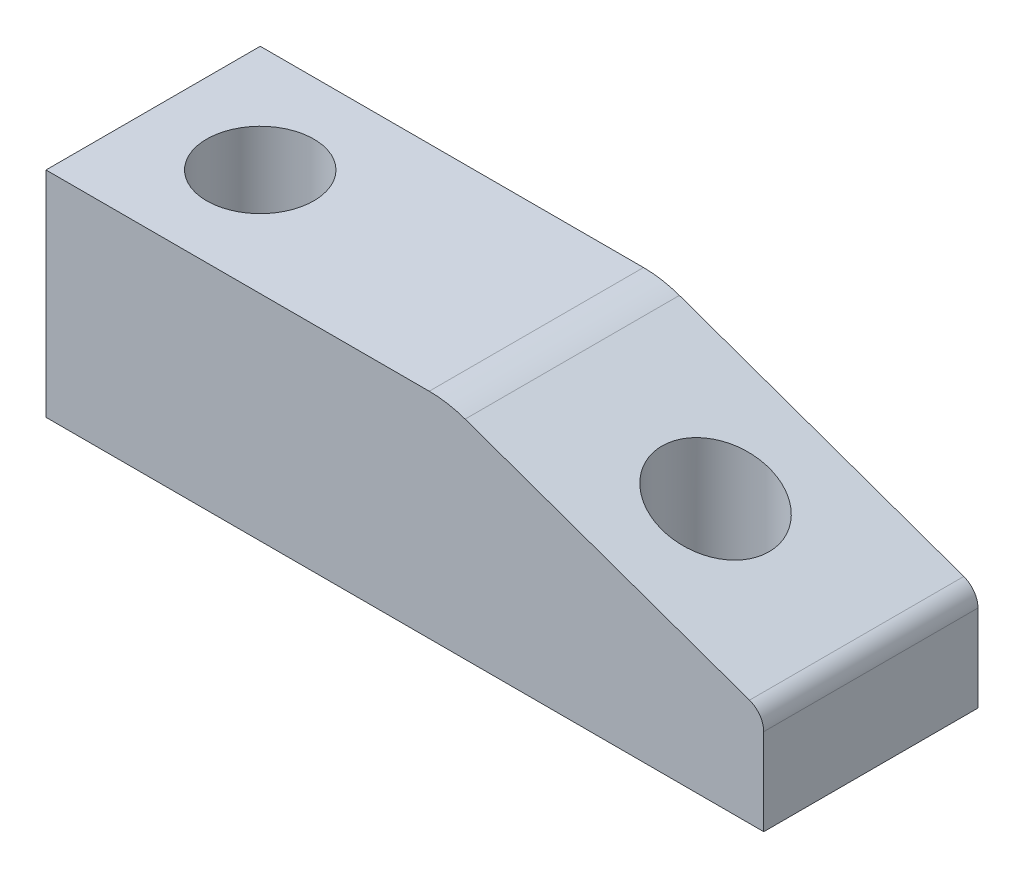
ISO-10303-21;
HEADER;
FILE_DESCRIPTION(('STEP AP214'),'2;1');
FILE_NAME('part.step','',(''),(''),'','','');
FILE_SCHEMA(('AUTOMOTIVE_DESIGN { 1 0 10303 214 1 1 1 1 }'));
ENDSEC;
DATA;
#1=APPLICATION_CONTEXT('core data for automotive mechanical design processes');
#2=APPLICATION_PROTOCOL_DEFINITION('international standard','automotive_design',2000,#1);
#3=PRODUCT_CONTEXT('',#1,'mechanical');
#4=PRODUCT('Part','Part','',(#3));
#5=PRODUCT_RELATED_PRODUCT_CATEGORY('part','',(#4));
#6=PRODUCT_DEFINITION_FORMATION('','',#4);
#7=PRODUCT_DEFINITION_CONTEXT('part definition',#1,'design');
#8=PRODUCT_DEFINITION('design','',#6,#7);
#9=PRODUCT_DEFINITION_SHAPE('','',#8);
#10=(LENGTH_UNIT() NAMED_UNIT(*) SI_UNIT(.MILLI.,.METRE.));
#11=(NAMED_UNIT(*) PLANE_ANGLE_UNIT() SI_UNIT($,.RADIAN.));
#12=(NAMED_UNIT(*) SI_UNIT($,.STERADIAN.) SOLID_ANGLE_UNIT());
#13=UNCERTAINTY_MEASURE_WITH_UNIT(LENGTH_MEASURE(1.E-05),#10,'distance_accuracy_value','');
#14=(GEOMETRIC_REPRESENTATION_CONTEXT(3) GLOBAL_UNCERTAINTY_ASSIGNED_CONTEXT((#13)) GLOBAL_UNIT_ASSIGNED_CONTEXT((#10,
#11,#12)) REPRESENTATION_CONTEXT('',''));
#15=CARTESIAN_POINT('',(0.,0.,0.));
#16=DIRECTION('',(0.,0.,1.));
#17=DIRECTION('',(1.,0.,0.));
#18=AXIS2_PLACEMENT_3D('',#15,#16,#17);
#19=CARTESIAN_POINT('',(67.,20.,-20.));
#20=DIRECTION('',(1.,0.,0.));
#21=DIRECTION('',(0.,0.,-1.));
#22=AXIS2_PLACEMENT_3D('',#19,#20,#21);
#23=PLANE('',#22);
#24=DIRECTION('',(0.,1.,0.));
#25=VECTOR('',#24,1.);
#26=CARTESIAN_POINT('',(67.,20.,-20.));
#27=LINE('',#26,#25);
#28=CARTESIAN_POINT('',(67.,-20.,-20.));
#29=VERTEX_POINT('',#28);
#30=CARTESIAN_POINT('',(67.,-3.82209310151896,-20.));
#31=VERTEX_POINT('',#30);
#32=EDGE_CURVE('E128',#29,#31,#27,.T.);
#33=ORIENTED_EDGE('',*,*,#32,.T.);
#34=DIRECTION('',(0.,0.,1.));
#35=VECTOR('',#34,1.);
#36=CARTESIAN_POINT('',(67.,-3.82209310151896,20.));
#37=LINE('',#36,#35);
#38=CARTESIAN_POINT('',(67.,-3.82209310151896,20.));
#39=VERTEX_POINT('',#38);
#40=EDGE_CURVE('E161',#31,#39,#37,.T.);
#41=ORIENTED_EDGE('',*,*,#40,.T.);
#42=DIRECTION('',(0.,1.,0.));
#43=VECTOR('',#42,1.);
#44=CARTESIAN_POINT('',(67.,20.,20.));
#45=LINE('',#44,#43);
#46=CARTESIAN_POINT('',(67.,-20.,20.));
#47=VERTEX_POINT('',#46);
#48=EDGE_CURVE('E109',#47,#39,#45,.T.);
#49=ORIENTED_EDGE('',*,*,#48,.F.);
#50=DIRECTION('',(0.,0.,1.));
#51=VECTOR('',#50,1.);
#52=CARTESIAN_POINT('',(67.,-20.,-20.));
#53=LINE('',#52,#51);
#54=EDGE_CURVE('E143',#29,#47,#53,.T.);
#55=ORIENTED_EDGE('',*,*,#54,.F.);
#56=EDGE_LOOP('',(#33,#41,#49,#55));
#57=FACE_BOUND('',#56,.T.);
#58=ADVANCED_FACE('F39',(#57),#23,.T.);
#59=CARTESIAN_POINT('',(-67.,-20.,-20.));
#60=DIRECTION('',(0.,-1.,0.));
#61=DIRECTION('',(0.,0.,-1.));
#62=AXIS2_PLACEMENT_3D('',#59,#60,#61);
#63=PLANE('',#62);
#64=CARTESIAN_POINT('',(-47.,-20.,0.));
#65=DIRECTION('',(0.,-1.,0.));
#66=DIRECTION('',(0.,0.,-1.));
#67=AXIS2_PLACEMENT_3D('',#64,#65,#66);
#68=CIRCLE('',#67,6.);
#69=CARTESIAN_POINT('',(-47.,-20.,-6.));
#70=VERTEX_POINT('',#69);
#71=EDGE_CURVE('E187',#70,#70,#68,.F.);
#72=ORIENTED_EDGE('',*,*,#71,.T.);
#73=EDGE_LOOP('',(#72));
#74=FACE_BOUND('',#73,.T.);
#75=CARTESIAN_POINT('',(38.,-20.,0.));
#76=DIRECTION('',(0.,-1.,0.));
#77=DIRECTION('',(0.,0.,-1.));
#78=AXIS2_PLACEMENT_3D('',#75,#76,#77);
#79=CIRCLE('',#78,6.);
#80=CARTESIAN_POINT('',(38.,-20.,-6.));
#81=VERTEX_POINT('',#80);
#82=EDGE_CURVE('E195',#81,#81,#79,.F.);
#83=ORIENTED_EDGE('',*,*,#82,.T.);
#84=EDGE_LOOP('',(#83));
#85=FACE_BOUND('',#84,.T.);
#86=ORIENTED_EDGE('',*,*,#54,.T.);
#87=DIRECTION('',(1.,0.,0.));
#88=VECTOR('',#87,1.);
#89=CARTESIAN_POINT('',(-67.,-20.,20.));
#90=LINE('',#89,#88);
#91=CARTESIAN_POINT('',(-67.,-20.,20.));
#92=VERTEX_POINT('',#91);
#93=EDGE_CURVE('E125',#92,#47,#90,.T.);
#94=ORIENTED_EDGE('',*,*,#93,.F.);
#95=DIRECTION('',(0.,0.,1.));
#96=VECTOR('',#95,1.);
#97=CARTESIAN_POINT('',(-67.,-20.,-20.));
#98=LINE('',#97,#96);
#99=CARTESIAN_POINT('',(-67.,-20.,-20.));
#100=VERTEX_POINT('',#99);
#101=EDGE_CURVE('E120',#100,#92,#98,.T.);
#102=ORIENTED_EDGE('',*,*,#101,.F.);
#103=DIRECTION('',(1.,0.,0.));
#104=VECTOR('',#103,1.);
#105=CARTESIAN_POINT('',(-67.,-20.,-20.));
#106=LINE('',#105,#104);
#107=EDGE_CURVE('E121',#100,#29,#106,.T.);
#108=ORIENTED_EDGE('',*,*,#107,.T.);
#109=EDGE_LOOP('',(#86,#94,#102,#108));
#110=FACE_BOUND('',#109,.T.);
#111=ADVANCED_FACE('F237',(#74,#85,#110),#63,.T.);
#112=CARTESIAN_POINT('',(-67.,20.,-20.));
#113=DIRECTION('',(-1.,0.,0.));
#114=DIRECTION('',(0.,0.,1.));
#115=AXIS2_PLACEMENT_3D('',#112,#113,#114);
#116=PLANE('',#115);
#117=ORIENTED_EDGE('',*,*,#101,.T.);
#118=DIRECTION('',(0.,-1.,0.));
#119=VECTOR('',#118,1.);
#120=CARTESIAN_POINT('',(-67.,20.,20.));
#121=LINE('',#120,#119);
#122=CARTESIAN_POINT('',(-67.,20.,20.));
#123=VERTEX_POINT('',#122);
#124=EDGE_CURVE('E103',#123,#92,#121,.T.);
#125=ORIENTED_EDGE('',*,*,#124,.F.);
#126=DIRECTION('',(0.,0.,1.));
#127=VECTOR('',#126,1.);
#128=CARTESIAN_POINT('',(-67.,20.,-20.));
#129=LINE('',#128,#127);
#130=CARTESIAN_POINT('',(-67.,20.,-20.));
#131=VERTEX_POINT('',#130);
#132=EDGE_CURVE('E112',#131,#123,#129,.T.);
#133=ORIENTED_EDGE('',*,*,#132,.F.);
#134=DIRECTION('',(0.,-1.,0.));
#135=VECTOR('',#134,1.);
#136=CARTESIAN_POINT('',(-67.,20.,-20.));
#137=LINE('',#136,#135);
#138=EDGE_CURVE('E137',#131,#100,#137,.T.);
#139=ORIENTED_EDGE('',*,*,#138,.T.);
#140=EDGE_LOOP('',(#117,#125,#133,#139));
#141=FACE_BOUND('',#140,.T.);
#142=ADVANCED_FACE('F123',(#141),#116,.T.);
#143=CARTESIAN_POINT('',(-67.,20.,-20.));
#144=DIRECTION('',(0.,1.,0.));
#145=DIRECTION('',(0.,0.,1.));
#146=AXIS2_PLACEMENT_3D('',#143,#144,#145);
#147=PLANE('',#146);
#148=CARTESIAN_POINT('',(-47.,20.,0.));
#149=DIRECTION('',(0.,1.,0.));
#150=DIRECTION('',(0.,0.,1.));
#151=AXIS2_PLACEMENT_3D('',#148,#149,#150);
#152=CIRCLE('',#151,10.);
#153=CARTESIAN_POINT('',(-47.,20.,10.));
#154=VERTEX_POINT('',#153);
#155=EDGE_CURVE('E186',#154,#154,#152,.T.);
#156=ORIENTED_EDGE('',*,*,#155,.F.);
#157=EDGE_LOOP('',(#156));
#158=FACE_BOUND('',#157,.T.);
#159=DIRECTION('',(-1.,0.,0.));
#160=VECTOR('',#159,1.);
#161=CARTESIAN_POINT('',(-67.,20.,20.));
#162=LINE('',#161,#160);
#163=CARTESIAN_POINT('',(4.54678738342408,20.,20.));
#164=VERTEX_POINT('',#163);
#165=EDGE_CURVE('E98',#164,#123,#162,.T.);
#166=ORIENTED_EDGE('',*,*,#165,.F.);
#167=DIRECTION('',(0.,0.,1.));
#168=VECTOR('',#167,1.);
#169=CARTESIAN_POINT('',(4.54678738342408,20.,-20.));
#170=LINE('',#169,#168);
#171=CARTESIAN_POINT('',(4.54678738342408,20.,-20.));
#172=VERTEX_POINT('',#171);
#173=EDGE_CURVE('E154',#164,#172,#170,.F.);
#174=ORIENTED_EDGE('',*,*,#173,.T.);
#175=DIRECTION('',(-1.,0.,0.));
#176=VECTOR('',#175,1.);
#177=CARTESIAN_POINT('',(-67.,20.,-20.));
#178=LINE('',#177,#176);
#179=EDGE_CURVE('E115',#172,#131,#178,.T.);
#180=ORIENTED_EDGE('',*,*,#179,.T.);
#181=ORIENTED_EDGE('',*,*,#132,.T.);
#182=EDGE_LOOP('',(#166,#174,#180,#181));
#183=FACE_BOUND('',#182,.T.);
#184=ADVANCED_FACE('F113',(#158,#183),#147,.T.);
#185=CARTESIAN_POINT('',(0.,0.,-20.));
#186=DIRECTION('',(0.,0.,1.));
#187=DIRECTION('',(1.,0.,0.));
#188=AXIS2_PLACEMENT_3D('',#185,#186,#187);
#189=PLANE('',#188);
#190=DIRECTION('',(-0.942102631717715,0.335324665526644,0.));
#191=VECTOR('',#190,1.);
#192=CARTESIAN_POINT('',(7.99999999999999,20.,-20.));
#193=LINE('',#192,#191);
#194=CARTESIAN_POINT('',(64.3412986621066,-0.0536825746481027,-20.));
#195=VERTEX_POINT('',#194);
#196=CARTESIAN_POINT('',(11.253280693957,18.8420526343543,-20.));
#197=VERTEX_POINT('',#196);
#198=EDGE_CURVE('E175',#195,#197,#193,.T.);
#199=ORIENTED_EDGE('',*,*,#198,.F.);
#200=CARTESIAN_POINT('',(63.,-3.82209310151896,-20.));
#201=DIRECTION('',(0.,0.,1.));
#202=DIRECTION('',(1.,0.,0.));
#203=AXIS2_PLACEMENT_3D('',#200,#201,#202);
#204=CIRCLE('',#203,4.);
#205=EDGE_CURVE('E11',#195,#31,#204,.F.);
#206=ORIENTED_EDGE('',*,*,#205,.T.);
#207=ORIENTED_EDGE('',*,*,#32,.F.);
#208=ORIENTED_EDGE('',*,*,#107,.F.);
#209=ORIENTED_EDGE('',*,*,#138,.F.);
#210=ORIENTED_EDGE('',*,*,#179,.F.);
#211=CARTESIAN_POINT('',(4.54678738342408,0.,-20.));
#212=DIRECTION('',(0.,0.,1.));
#213=DIRECTION('',(1.,0.,0.));
#214=AXIS2_PLACEMENT_3D('',#211,#212,#213);
#215=CIRCLE('',#214,20.);
#216=EDGE_CURVE('E157',#172,#197,#215,.F.);
#217=ORIENTED_EDGE('',*,*,#216,.T.);
#218=EDGE_LOOP('',(#199,#206,#207,#208,#209,#210,#217));
#219=FACE_BOUND('',#218,.T.);
#220=ADVANCED_FACE('F229',(#219),#189,.F.);
#221=CARTESIAN_POINT('',(0.,0.,20.));
#222=DIRECTION('',(0.,0.,1.));
#223=DIRECTION('',(1.,0.,0.));
#224=AXIS2_PLACEMENT_3D('',#221,#222,#223);
#225=PLANE('',#224);
#226=ORIENTED_EDGE('',*,*,#48,.T.);
#227=CARTESIAN_POINT('',(63.,-3.82209310151896,20.));
#228=DIRECTION('',(0.,0.,1.));
#229=DIRECTION('',(1.,0.,0.));
#230=AXIS2_PLACEMENT_3D('',#227,#228,#229);
#231=CIRCLE('',#230,4.);
#232=CARTESIAN_POINT('',(64.3412986621066,-0.0536825746480923,20.));
#233=VERTEX_POINT('',#232);
#234=EDGE_CURVE('E63',#39,#233,#231,.T.);
#235=ORIENTED_EDGE('',*,*,#234,.T.);
#236=DIRECTION('',(0.942102631717715,-0.335324665526644,0.));
#237=VECTOR('',#236,1.);
#238=CARTESIAN_POINT('',(7.99999999999999,20.,20.));
#239=LINE('',#238,#237);
#240=CARTESIAN_POINT('',(11.253280693957,18.8420526343543,20.));
#241=VERTEX_POINT('',#240);
#242=EDGE_CURVE('E177',#241,#233,#239,.T.);
#243=ORIENTED_EDGE('',*,*,#242,.F.);
#244=CARTESIAN_POINT('',(4.54678738342408,0.,20.));
#245=DIRECTION('',(0.,0.,1.));
#246=DIRECTION('',(1.,0.,0.));
#247=AXIS2_PLACEMENT_3D('',#244,#245,#246);
#248=CIRCLE('',#247,20.);
#249=EDGE_CURVE('E105',#241,#164,#248,.T.);
#250=ORIENTED_EDGE('',*,*,#249,.T.);
#251=ORIENTED_EDGE('',*,*,#165,.T.);
#252=ORIENTED_EDGE('',*,*,#124,.T.);
#253=ORIENTED_EDGE('',*,*,#93,.T.);
#254=EDGE_LOOP('',(#226,#235,#243,#250,#251,#252,#253));
#255=FACE_BOUND('',#254,.T.);
#256=ADVANCED_FACE('F100',(#255),#225,.T.);
#257=CARTESIAN_POINT('',(7.99999999999999,20.,-82.6258732474047));
#258=DIRECTION('',(-0.335324665526644,-0.942102631717715,0.));
#259=DIRECTION('',(0.942102631717715,-0.335324665526644,0.));
#260=AXIS2_PLACEMENT_3D('',#257,#258,#259);
#261=PLANE('',#260);
#262=CARTESIAN_POINT('',(38.,9.32203389830509,0.));
#263=DIRECTION('',(-0.335324665526644,-0.942102631717715,0.));
#264=DIRECTION('',(-0.942102631717715,0.335324665526644,0.));
#265=AXIS2_PLACEMENT_3D('',#262,#263,#264);
#266=ELLIPSE('',#265,10.6145547876957,10.);
#267=CARTESIAN_POINT('',(28.,12.8813559322034,0.));
#268=VERTEX_POINT('',#267);
#269=EDGE_CURVE('E43',#268,#268,#266,.T.);
#270=ORIENTED_EDGE('',*,*,#269,.T.);
#271=EDGE_LOOP('',(#270));
#272=FACE_BOUND('',#271,.T.);
#273=ORIENTED_EDGE('',*,*,#242,.T.);
#274=DIRECTION('',(0.,0.,1.));
#275=VECTOR('',#274,1.);
#276=CARTESIAN_POINT('',(64.3412986621066,-0.0536825746480954,-20.));
#277=LINE('',#276,#275);
#278=EDGE_CURVE('E49',#233,#195,#277,.F.);
#279=ORIENTED_EDGE('',*,*,#278,.T.);
#280=ORIENTED_EDGE('',*,*,#198,.T.);
#281=DIRECTION('',(0.,0.,1.));
#282=VECTOR('',#281,1.);
#283=CARTESIAN_POINT('',(11.253280693957,18.8420526343543,20.));
#284=LINE('',#283,#282);
#285=EDGE_CURVE('E146',#197,#241,#284,.T.);
#286=ORIENTED_EDGE('',*,*,#285,.T.);
#287=EDGE_LOOP('',(#273,#279,#280,#286));
#288=FACE_BOUND('',#287,.T.);
#289=ADVANCED_FACE('F248',(#272,#288),#261,.F.);
#290=CARTESIAN_POINT('',(4.54678738342408,0.,-82.6258732474047));
#291=DIRECTION('',(0.,0.,-1.));
#292=DIRECTION('',(-1.,0.,0.));
#293=AXIS2_PLACEMENT_3D('',#290,#291,#292);
#294=CYLINDRICAL_SURFACE('',#293,20.);
#295=ORIENTED_EDGE('',*,*,#216,.F.);
#296=ORIENTED_EDGE('',*,*,#173,.F.);
#297=ORIENTED_EDGE('',*,*,#249,.F.);
#298=ORIENTED_EDGE('',*,*,#285,.F.);
#299=EDGE_LOOP('',(#295,#296,#297,#298));
#300=FACE_BOUND('',#299,.T.);
#301=ADVANCED_FACE('F246',(#300),#294,.T.);
#302=CARTESIAN_POINT('',(63.,-3.82209310151896,-20.));
#303=DIRECTION('',(0.,0.,-1.));
#304=DIRECTION('',(-1.,0.,0.));
#305=AXIS2_PLACEMENT_3D('',#302,#303,#304);
#306=CYLINDRICAL_SURFACE('',#305,4.);
#307=ORIENTED_EDGE('',*,*,#205,.F.);
#308=ORIENTED_EDGE('',*,*,#278,.F.);
#309=ORIENTED_EDGE('',*,*,#234,.F.);
#310=ORIENTED_EDGE('',*,*,#40,.F.);
#311=EDGE_LOOP('',(#307,#308,#309,#310));
#312=FACE_BOUND('',#311,.T.);
#313=ADVANCED_FACE('F41',(#312),#306,.T.);
#314=CARTESIAN_POINT('',(38.,-9.,0.));
#315=DIRECTION('',(0.,1.,0.));
#316=DIRECTION('',(0.,0.,1.));
#317=AXIS2_PLACEMENT_3D('',#314,#315,#316);
#318=CYLINDRICAL_SURFACE('',#317,10.);
#319=CARTESIAN_POINT('',(38.,-9.,0.));
#320=DIRECTION('',(0.,1.,0.));
#321=DIRECTION('',(0.,0.,1.));
#322=AXIS2_PLACEMENT_3D('',#319,#320,#321);
#323=CIRCLE('',#322,10.);
#324=CARTESIAN_POINT('',(38.,-9.,10.));
#325=VERTEX_POINT('',#324);
#326=EDGE_CURVE('E182',#325,#325,#323,.T.);
#327=ORIENTED_EDGE('',*,*,#326,.F.);
#328=EDGE_LOOP('',(#327));
#329=FACE_BOUND('',#328,.T.);
#330=ORIENTED_EDGE('',*,*,#269,.F.);
#331=EDGE_LOOP('',(#330));
#332=FACE_BOUND('',#331,.T.);
#333=ADVANCED_FACE('F254',(#329,#332),#318,.F.);
#334=CARTESIAN_POINT('',(38.,-9.,0.));
#335=DIRECTION('',(0.,1.,0.));
#336=DIRECTION('',(0.,0.,1.));
#337=AXIS2_PLACEMENT_3D('',#334,#335,#336);
#338=PLANE('',#337);
#339=CARTESIAN_POINT('',(38.,-9.,0.));
#340=DIRECTION('',(0.,1.,0.));
#341=DIRECTION('',(0.,0.,1.));
#342=AXIS2_PLACEMENT_3D('',#339,#340,#341);
#343=CIRCLE('',#342,6.);
#344=CARTESIAN_POINT('',(38.,-9.,6.));
#345=VERTEX_POINT('',#344);
#346=EDGE_CURVE('E200',#345,#345,#343,.T.);
#347=ORIENTED_EDGE('',*,*,#346,.F.);
#348=EDGE_LOOP('',(#347));
#349=FACE_BOUND('',#348,.T.);
#350=ORIENTED_EDGE('',*,*,#326,.T.);
#351=EDGE_LOOP('',(#350));
#352=FACE_BOUND('',#351,.T.);
#353=ADVANCED_FACE('F224',(#349,#352),#338,.T.);
#354=CARTESIAN_POINT('',(-47.,-9.,0.));
#355=DIRECTION('',(0.,1.,0.));
#356=DIRECTION('',(0.,0.,1.));
#357=AXIS2_PLACEMENT_3D('',#354,#355,#356);
#358=CYLINDRICAL_SURFACE('',#357,10.);
#359=CARTESIAN_POINT('',(-47.,-9.,0.));
#360=DIRECTION('',(0.,1.,0.));
#361=DIRECTION('',(0.,0.,1.));
#362=AXIS2_PLACEMENT_3D('',#359,#360,#361);
#363=CIRCLE('',#362,10.);
#364=CARTESIAN_POINT('',(-47.,-9.,10.));
#365=VERTEX_POINT('',#364);
#366=EDGE_CURVE('E191',#365,#365,#363,.T.);
#367=CARTESIAN_POINT('',(-47.,-9.,10.));
#368=CARTESIAN_POINT('',(-47.,-8.69791666666666,10.));
#369=CARTESIAN_POINT('',(-47.,-8.39583333333333,10.));
#370=CARTESIAN_POINT('',(-47.,-7.79166666666667,10.));
#371=CARTESIAN_POINT('',(-47.,-7.48958333333333,10.));
#372=CARTESIAN_POINT('',(-47.,-6.88541666666667,10.));
#373=CARTESIAN_POINT('',(-47.,-6.58333333333333,10.));
#374=CARTESIAN_POINT('',(-47.,-5.97916666666667,10.));
#375=CARTESIAN_POINT('',(-47.,-5.67708333333333,10.));
#376=CARTESIAN_POINT('',(-47.,-5.07291666666667,10.));
#377=CARTESIAN_POINT('',(-47.,-4.77083333333333,10.));
#378=CARTESIAN_POINT('',(-47.,-4.16666666666667,10.));
#379=CARTESIAN_POINT('',(-47.,-3.86458333333333,10.));
#380=CARTESIAN_POINT('',(-47.,-3.26041666666666,10.));
#381=CARTESIAN_POINT('',(-47.,-2.95833333333333,10.));
#382=CARTESIAN_POINT('',(-47.,-2.35416666666666,10.));
#383=CARTESIAN_POINT('',(-47.,-2.05208333333333,10.));
#384=CARTESIAN_POINT('',(-47.,-1.44791666666666,10.));
#385=CARTESIAN_POINT('',(-47.,-1.14583333333333,10.));
#386=CARTESIAN_POINT('',(-47.,-0.541666666666664,10.));
#387=CARTESIAN_POINT('',(-47.,-0.239583333333331,10.));
#388=CARTESIAN_POINT('',(-47.,0.364583333333335,10.));
#389=CARTESIAN_POINT('',(-47.,0.666666666666669,10.));
#390=CARTESIAN_POINT('',(-47.,1.27083333333334,10.));
#391=CARTESIAN_POINT('',(-47.,1.57291666666667,10.));
#392=CARTESIAN_POINT('',(-47.,2.17708333333334,10.));
#393=CARTESIAN_POINT('',(-47.,2.47916666666667,10.));
#394=CARTESIAN_POINT('',(-47.,3.08333333333334,10.));
#395=CARTESIAN_POINT('',(-47.,3.38541666666667,10.));
#396=CARTESIAN_POINT('',(-47.,3.98958333333334,10.));
#397=CARTESIAN_POINT('',(-47.,4.29166666666667,10.));
#398=CARTESIAN_POINT('',(-47.,4.89583333333334,10.));
#399=CARTESIAN_POINT('',(-47.,5.19791666666667,10.));
#400=CARTESIAN_POINT('',(-47.,5.80208333333334,10.));
#401=CARTESIAN_POINT('',(-47.,6.10416666666667,10.));
#402=CARTESIAN_POINT('',(-47.,6.70833333333334,10.));
#403=CARTESIAN_POINT('',(-47.,7.01041666666667,10.));
#404=CARTESIAN_POINT('',(-47.,7.61458333333333,10.));
#405=CARTESIAN_POINT('',(-47.,7.91666666666667,10.));
#406=CARTESIAN_POINT('',(-47.,8.52083333333333,10.));
#407=CARTESIAN_POINT('',(-47.,8.82291666666667,10.));
#408=CARTESIAN_POINT('',(-47.,9.42708333333333,10.));
#409=CARTESIAN_POINT('',(-47.,9.72916666666667,10.));
#410=CARTESIAN_POINT('',(-47.,10.3333333333333,10.));
#411=CARTESIAN_POINT('',(-47.,10.6354166666667,10.));
#412=CARTESIAN_POINT('',(-47.,11.2395833333333,10.));
#413=CARTESIAN_POINT('',(-47.,11.5416666666667,10.));
#414=CARTESIAN_POINT('',(-47.,12.1458333333333,10.));
#415=CARTESIAN_POINT('',(-47.,12.4479166666667,10.));
#416=CARTESIAN_POINT('',(-47.,13.0520833333333,10.));
#417=CARTESIAN_POINT('',(-47.,13.3541666666667,10.));
#418=CARTESIAN_POINT('',(-47.,13.9583333333333,10.));
#419=CARTESIAN_POINT('',(-47.,14.2604166666667,10.));
#420=CARTESIAN_POINT('',(-47.,14.8645833333333,10.));
#421=CARTESIAN_POINT('',(-47.,15.1666666666667,10.));
#422=CARTESIAN_POINT('',(-47.,15.7708333333333,10.));
#423=CARTESIAN_POINT('',(-47.,16.0729166666667,10.));
#424=CARTESIAN_POINT('',(-47.,16.6770833333333,10.));
#425=CARTESIAN_POINT('',(-47.,16.9791666666667,10.));
#426=CARTESIAN_POINT('',(-47.,17.5833333333333,10.));
#427=CARTESIAN_POINT('',(-47.,17.8854166666667,10.));
#428=CARTESIAN_POINT('',(-47.,18.4895833333333,10.));
#429=CARTESIAN_POINT('',(-47.,18.7916666666667,10.));
#430=CARTESIAN_POINT('',(-47.,19.3958333333333,10.));
#431=CARTESIAN_POINT('',(-47.,19.6979166666667,10.));
#432=CARTESIAN_POINT('',(-47.,20.,10.));
#433=B_SPLINE_CURVE_WITH_KNOTS('',3,(#367,#368,#369,#370,#371,#372,#373,#374,#375,#376,#377,
#378,#379,#380,#381,#382,#383,#384,#385,#386,#387,#388,#389,#390,#391,#392,#393,#394,#395,#396,
#397,#398,#399,#400,#401,#402,#403,#404,#405,#406,#407,#408,#409,#410,#411,#412,#413,#414,#415,
#416,#417,#418,#419,#420,#421,#422,#423,#424,#425,#426,#427,#428,#429,#430,#431,#432),
.UNSPECIFIED.,.F.,.F.,(4,2,2,2,2,2,2,2,2,2,2,2,2,2,2,2,2,2,2,2,2,2,2,2,2,2,2,2,2,2,2,2,4),(0.,
0.906249999999999,1.8125,2.71875,3.625,4.53125,5.4375,6.34375,7.25,8.15625,9.0625,9.96875,
10.875,11.78125,12.6875,13.59375,14.5,15.40625,16.3125,17.21875,18.125,19.03125,19.9375,
20.84375,21.75,22.65625,23.5625,24.46875,25.375,26.28125,27.1875,28.09375,29.),.UNSPECIFIED.);
#434=EDGE_CURVE('BSEAM218',#365,#154,#433,.T.);
#435=ORIENTED_EDGE('',*,*,#366,.F.);
#436=ORIENTED_EDGE('',*,*,#155,.T.);
#437=ORIENTED_EDGE('',*,*,#434,.T.);
#438=ORIENTED_EDGE('',*,*,#434,.F.);
#439=EDGE_LOOP('',(#435,#437,#436,#438));
#440=FACE_BOUND('',#439,.T.);
#441=ADVANCED_FACE('F218',(#440),#358,.F.);
#442=CARTESIAN_POINT('',(-47.,-9.,0.));
#443=DIRECTION('',(0.,1.,0.));
#444=DIRECTION('',(0.,0.,1.));
#445=AXIS2_PLACEMENT_3D('',#442,#443,#444);
#446=PLANE('',#445);
#447=CARTESIAN_POINT('',(-47.,-9.,0.));
#448=DIRECTION('',(0.,1.,0.));
#449=DIRECTION('',(0.,0.,1.));
#450=AXIS2_PLACEMENT_3D('',#447,#448,#449);
#451=CIRCLE('',#450,6.);
#452=CARTESIAN_POINT('',(-47.,-9.,6.));
#453=VERTEX_POINT('',#452);
#454=EDGE_CURVE('E199',#453,#453,#451,.T.);
#455=ORIENTED_EDGE('',*,*,#454,.F.);
#456=EDGE_LOOP('',(#455));
#457=FACE_BOUND('',#456,.T.);
#458=ORIENTED_EDGE('',*,*,#366,.T.);
#459=EDGE_LOOP('',(#458));
#460=FACE_BOUND('',#459,.T.);
#461=ADVANCED_FACE('F214',(#457,#460),#446,.T.);
#462=CARTESIAN_POINT('',(38.,-36.9705627484772,0.));
#463=DIRECTION('',(0.,1.,0.));
#464=DIRECTION('',(0.,0.,1.));
#465=AXIS2_PLACEMENT_3D('',#462,#463,#464);
#466=CYLINDRICAL_SURFACE('',#465,6.);
#467=ORIENTED_EDGE('',*,*,#346,.T.);
#468=EDGE_LOOP('',(#467));
#469=FACE_BOUND('',#468,.T.);
#470=ORIENTED_EDGE('',*,*,#82,.F.);
#471=EDGE_LOOP('',(#470));
#472=FACE_BOUND('',#471,.T.);
#473=ADVANCED_FACE('F217',(#469,#472),#466,.F.);
#474=CARTESIAN_POINT('',(-47.,-36.9705627484772,0.));
#475=DIRECTION('',(0.,1.,0.));
#476=DIRECTION('',(0.,0.,1.));
#477=AXIS2_PLACEMENT_3D('',#474,#475,#476);
#478=CYLINDRICAL_SURFACE('',#477,6.);
#479=ORIENTED_EDGE('',*,*,#454,.T.);
#480=EDGE_LOOP('',(#479));
#481=FACE_BOUND('',#480,.T.);
#482=ORIENTED_EDGE('',*,*,#71,.F.);
#483=EDGE_LOOP('',(#482));
#484=FACE_BOUND('',#483,.T.);
#485=ADVANCED_FACE('F211',(#481,#484),#478,.F.);
#486=CLOSED_SHELL('',(#58,#111,#142,#184,#220,#256,#289,#301,#313,#333,#353,#441,#461,#473,#485));
#487=MANIFOLD_SOLID_BREP('B2',#486);
#488=ADVANCED_BREP_SHAPE_REPRESENTATION('',(#18,#487),#14);
#489=SHAPE_DEFINITION_REPRESENTATION(#9,#488);
ENDSEC;
END-ISO-10303-21;
